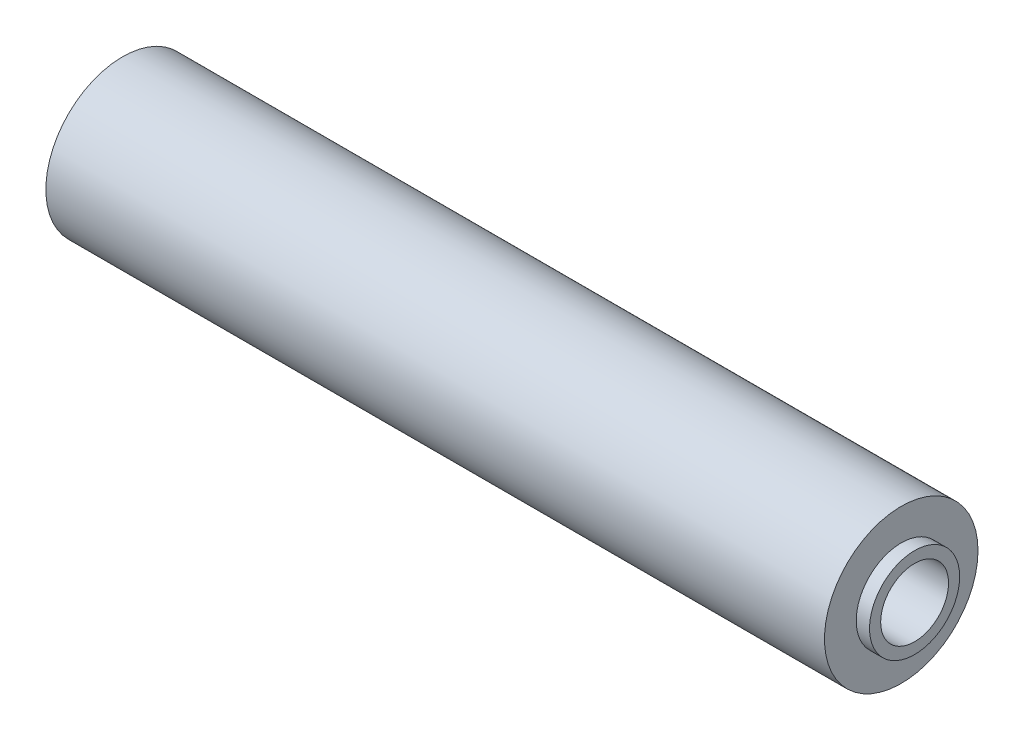
ISO-10303-21;
HEADER;
FILE_DESCRIPTION(('STEP AP214'),'2;1');
FILE_NAME('part.step','',(''),(''),'','','');
FILE_SCHEMA(('AUTOMOTIVE_DESIGN { 1 0 10303 214 1 1 1 1 }'));
ENDSEC;
DATA;
#1=APPLICATION_CONTEXT('core data for automotive mechanical design processes');
#2=APPLICATION_PROTOCOL_DEFINITION('international standard','automotive_design',2000,#1);
#3=PRODUCT_CONTEXT('',#1,'mechanical');
#4=PRODUCT('Part','Part','',(#3));
#5=PRODUCT_RELATED_PRODUCT_CATEGORY('part','',(#4));
#6=PRODUCT_DEFINITION_FORMATION('','',#4);
#7=PRODUCT_DEFINITION_CONTEXT('part definition',#1,'design');
#8=PRODUCT_DEFINITION('design','',#6,#7);
#9=PRODUCT_DEFINITION_SHAPE('','',#8);
#10=(LENGTH_UNIT() NAMED_UNIT(*) SI_UNIT(.MILLI.,.METRE.));
#11=(NAMED_UNIT(*) PLANE_ANGLE_UNIT() SI_UNIT($,.RADIAN.));
#12=(NAMED_UNIT(*) SI_UNIT($,.STERADIAN.) SOLID_ANGLE_UNIT());
#13=UNCERTAINTY_MEASURE_WITH_UNIT(LENGTH_MEASURE(1.E-05),#10,'distance_accuracy_value','');
#14=(GEOMETRIC_REPRESENTATION_CONTEXT(3) GLOBAL_UNCERTAINTY_ASSIGNED_CONTEXT((#13)) GLOBAL_UNIT_ASSIGNED_CONTEXT((#10,
#11,#12)) REPRESENTATION_CONTEXT('',''));
#15=CARTESIAN_POINT('',(0.,0.,0.));
#16=DIRECTION('',(0.,0.,1.));
#17=DIRECTION('',(1.,0.,0.));
#18=AXIS2_PLACEMENT_3D('',#15,#16,#17);
#19=CARTESIAN_POINT('',(62.26,0.,0.));
#20=DIRECTION('',(1.,0.,0.));
#21=DIRECTION('',(0.,0.,-1.));
#22=AXIS2_PLACEMENT_3D('',#19,#20,#21);
#23=CYLINDRICAL_SURFACE('',#22,6.9);
#24=CARTESIAN_POINT('',(35.,0.,0.));
#25=DIRECTION('',(1.,0.,0.));
#26=DIRECTION('',(0.,0.,-1.));
#27=AXIS2_PLACEMENT_3D('',#24,#25,#26);
#28=CIRCLE('',#27,6.9);
#29=CARTESIAN_POINT('',(35.,0.,-6.9));
#30=VERTEX_POINT('',#29);
#31=EDGE_CURVE('E61',#30,#30,#28,.T.);
#32=ORIENTED_EDGE('',*,*,#31,.F.);
#33=EDGE_LOOP('',(#32));
#34=FACE_BOUND('',#33,.T.);
#35=CARTESIAN_POINT('',(-35.,0.,0.));
#36=DIRECTION('',(1.,0.,0.));
#37=DIRECTION('',(0.,0.,-1.));
#38=AXIS2_PLACEMENT_3D('',#35,#36,#37);
#39=CIRCLE('',#38,6.9);
#40=CARTESIAN_POINT('',(-35.,0.,-6.9));
#41=VERTEX_POINT('',#40);
#42=EDGE_CURVE('E10',#41,#41,#39,.T.);
#43=ORIENTED_EDGE('',*,*,#42,.T.);
#44=EDGE_LOOP('',(#43));
#45=FACE_BOUND('',#44,.T.);
#46=ADVANCED_FACE('F39',(#34,#45),#23,.T.);
#47=CARTESIAN_POINT('',(-35.,0.,0.));
#48=DIRECTION('',(1.,0.,0.));
#49=DIRECTION('',(0.,0.,-1.));
#50=AXIS2_PLACEMENT_3D('',#47,#48,#49);
#51=PLANE('',#50);
#52=ORIENTED_EDGE('',*,*,#42,.F.);
#53=EDGE_LOOP('',(#52));
#54=FACE_BOUND('',#53,.T.);
#55=CARTESIAN_POINT('',(-35.,0.,0.));
#56=DIRECTION('',(1.,0.,0.));
#57=DIRECTION('',(0.,0.,-1.));
#58=AXIS2_PLACEMENT_3D('',#55,#56,#57);
#59=CIRCLE('',#58,4.05);
#60=CARTESIAN_POINT('',(-35.,0.,-4.05));
#61=VERTEX_POINT('',#60);
#62=EDGE_CURVE('E45',#61,#61,#59,.T.);
#63=ORIENTED_EDGE('',*,*,#62,.T.);
#64=EDGE_LOOP('',(#63));
#65=FACE_BOUND('',#64,.T.);
#66=ADVANCED_FACE('F99',(#54,#65),#51,.F.);
#67=CARTESIAN_POINT('',(62.26,0.,0.));
#68=DIRECTION('',(1.,0.,0.));
#69=DIRECTION('',(0.,0.,-1.));
#70=AXIS2_PLACEMENT_3D('',#67,#68,#69);
#71=CYLINDRICAL_SURFACE('',#70,4.05);
#72=CARTESIAN_POINT('',(-36.2,0.,0.));
#73=DIRECTION('',(1.,0.,0.));
#74=DIRECTION('',(0.,0.,-1.));
#75=AXIS2_PLACEMENT_3D('',#72,#73,#74);
#76=CIRCLE('',#75,4.05);
#77=CARTESIAN_POINT('',(-36.2,0.,-4.05));
#78=VERTEX_POINT('',#77);
#79=EDGE_CURVE('E49',#78,#78,#76,.T.);
#80=ORIENTED_EDGE('',*,*,#79,.T.);
#81=EDGE_LOOP('',(#80));
#82=FACE_BOUND('',#81,.T.);
#83=ORIENTED_EDGE('',*,*,#62,.F.);
#84=EDGE_LOOP('',(#83));
#85=FACE_BOUND('',#84,.T.);
#86=ADVANCED_FACE('F104',(#82,#85),#71,.T.);
#87=CARTESIAN_POINT('',(-36.2,0.,0.));
#88=DIRECTION('',(-1.,0.,0.));
#89=DIRECTION('',(0.,0.,1.));
#90=AXIS2_PLACEMENT_3D('',#87,#88,#89);
#91=PLANE('',#90);
#92=CARTESIAN_POINT('',(-36.2,0.,0.));
#93=DIRECTION('',(-1.,0.,0.));
#94=DIRECTION('',(0.,0.,1.));
#95=AXIS2_PLACEMENT_3D('',#92,#93,#94);
#96=CIRCLE('',#95,3.05);
#97=CARTESIAN_POINT('',(-36.2,0.,3.05));
#98=VERTEX_POINT('',#97);
#99=EDGE_CURVE('E67',#98,#98,#96,.F.);
#100=ORIENTED_EDGE('',*,*,#99,.T.);
#101=EDGE_LOOP('',(#100));
#102=FACE_BOUND('',#101,.T.);
#103=ORIENTED_EDGE('',*,*,#79,.F.);
#104=EDGE_LOOP('',(#103));
#105=FACE_BOUND('',#104,.T.);
#106=ADVANCED_FACE('F71',(#102,#105),#91,.T.);
#107=CARTESIAN_POINT('',(36.2,0.,0.));
#108=DIRECTION('',(-1.,0.,0.));
#109=DIRECTION('',(0.,0.,1.));
#110=AXIS2_PLACEMENT_3D('',#107,#108,#109);
#111=PLANE('',#110);
#112=CARTESIAN_POINT('',(36.2,0.,0.));
#113=DIRECTION('',(1.,0.,0.));
#114=DIRECTION('',(0.,0.,-1.));
#115=AXIS2_PLACEMENT_3D('',#112,#113,#114);
#116=CIRCLE('',#115,3.05);
#117=CARTESIAN_POINT('',(36.2,0.,-3.05));
#118=VERTEX_POINT('',#117);
#119=EDGE_CURVE('E64',#118,#118,#116,.F.);
#120=ORIENTED_EDGE('',*,*,#119,.T.);
#121=EDGE_LOOP('',(#120));
#122=FACE_BOUND('',#121,.T.);
#123=CARTESIAN_POINT('',(36.2,0.,0.));
#124=DIRECTION('',(1.,0.,0.));
#125=DIRECTION('',(0.,0.,-1.));
#126=AXIS2_PLACEMENT_3D('',#123,#124,#125);
#127=CIRCLE('',#126,4.05);
#128=CARTESIAN_POINT('',(36.2,0.,-4.05));
#129=VERTEX_POINT('',#128);
#130=EDGE_CURVE('E53',#129,#129,#127,.T.);
#131=ORIENTED_EDGE('',*,*,#130,.T.);
#132=EDGE_LOOP('',(#131));
#133=FACE_BOUND('',#132,.T.);
#134=ADVANCED_FACE('F81',(#122,#133),#111,.F.);
#135=CARTESIAN_POINT('',(62.26,0.,0.));
#136=DIRECTION('',(1.,0.,0.));
#137=DIRECTION('',(0.,0.,-1.));
#138=AXIS2_PLACEMENT_3D('',#135,#136,#137);
#139=CYLINDRICAL_SURFACE('',#138,4.05);
#140=ORIENTED_EDGE('',*,*,#130,.F.);
#141=EDGE_LOOP('',(#140));
#142=FACE_BOUND('',#141,.T.);
#143=CARTESIAN_POINT('',(35.,0.,0.));
#144=DIRECTION('',(1.,0.,0.));
#145=DIRECTION('',(0.,0.,-1.));
#146=AXIS2_PLACEMENT_3D('',#143,#144,#145);
#147=CIRCLE('',#146,4.05);
#148=CARTESIAN_POINT('',(35.,0.,-4.05));
#149=VERTEX_POINT('',#148);
#150=EDGE_CURVE('E58',#149,#149,#147,.T.);
#151=ORIENTED_EDGE('',*,*,#150,.T.);
#152=EDGE_LOOP('',(#151));
#153=FACE_BOUND('',#152,.T.);
#154=ADVANCED_FACE('F84',(#142,#153),#139,.T.);
#155=CARTESIAN_POINT('',(35.,0.,0.));
#156=DIRECTION('',(1.,0.,0.));
#157=DIRECTION('',(0.,0.,-1.));
#158=AXIS2_PLACEMENT_3D('',#155,#156,#157);
#159=PLANE('',#158);
#160=ORIENTED_EDGE('',*,*,#31,.T.);
#161=EDGE_LOOP('',(#160));
#162=FACE_BOUND('',#161,.T.);
#163=ORIENTED_EDGE('',*,*,#150,.F.);
#164=EDGE_LOOP('',(#163));
#165=FACE_BOUND('',#164,.T.);
#166=ADVANCED_FACE('F77',(#162,#165),#159,.T.);
#167=CARTESIAN_POINT('',(56.6,0.,0.));
#168=DIRECTION('',(-1.,0.,0.));
#169=DIRECTION('',(0.,0.,1.));
#170=AXIS2_PLACEMENT_3D('',#167,#168,#169);
#171=CYLINDRICAL_SURFACE('',#170,3.05);
#172=ORIENTED_EDGE('',*,*,#99,.F.);
#173=EDGE_LOOP('',(#172));
#174=FACE_BOUND('',#173,.T.);
#175=ORIENTED_EDGE('',*,*,#119,.F.);
#176=EDGE_LOOP('',(#175));
#177=FACE_BOUND('',#176,.T.);
#178=ADVANCED_FACE('F74',(#174,#177),#171,.F.);
#179=CLOSED_SHELL('',(#46,#66,#86,#106,#134,#154,#166,#178));
#180=MANIFOLD_SOLID_BREP('B2',#179);
#181=ADVANCED_BREP_SHAPE_REPRESENTATION('',(#18,#180),#14);
#182=SHAPE_DEFINITION_REPRESENTATION(#9,#181);
ENDSEC;
END-ISO-10303-21;
